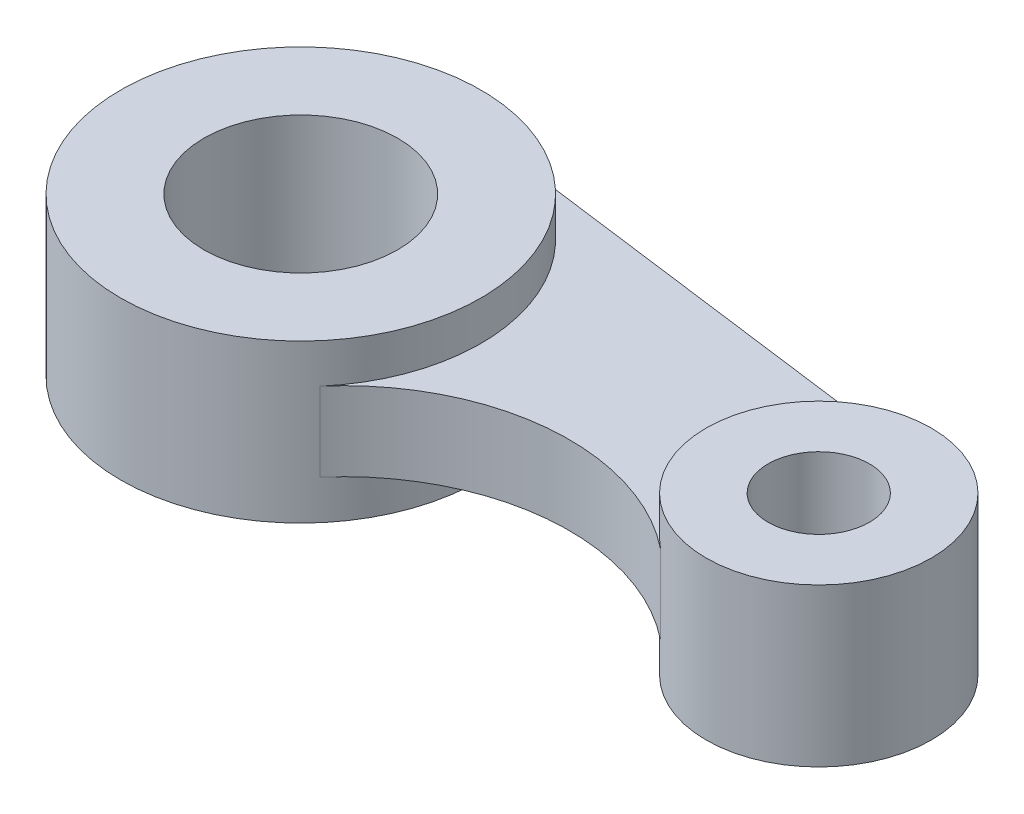
ISO-10303-21;
HEADER;
FILE_DESCRIPTION(('STEP AP214'),'2;1');
FILE_NAME('part.step','',(''),(''),'','','');
FILE_SCHEMA(('AUTOMOTIVE_DESIGN { 1 0 10303 214 1 1 1 1 }'));
ENDSEC;
DATA;
#1=APPLICATION_CONTEXT('core data for automotive mechanical design processes');
#2=APPLICATION_PROTOCOL_DEFINITION('international standard','automotive_design',2000,#1);
#3=PRODUCT_CONTEXT('',#1,'mechanical');
#4=PRODUCT('Part','Part','',(#3));
#5=PRODUCT_RELATED_PRODUCT_CATEGORY('part','',(#4));
#6=PRODUCT_DEFINITION_FORMATION('','',#4);
#7=PRODUCT_DEFINITION_CONTEXT('part definition',#1,'design');
#8=PRODUCT_DEFINITION('design','',#6,#7);
#9=PRODUCT_DEFINITION_SHAPE('','',#8);
#10=(LENGTH_UNIT() NAMED_UNIT(*) SI_UNIT(.MILLI.,.METRE.));
#11=(NAMED_UNIT(*) PLANE_ANGLE_UNIT() SI_UNIT($,.RADIAN.));
#12=(NAMED_UNIT(*) SI_UNIT($,.STERADIAN.) SOLID_ANGLE_UNIT());
#13=UNCERTAINTY_MEASURE_WITH_UNIT(LENGTH_MEASURE(1.E-05),#10,'distance_accuracy_value','');
#14=(GEOMETRIC_REPRESENTATION_CONTEXT(3) GLOBAL_UNCERTAINTY_ASSIGNED_CONTEXT((#13)) GLOBAL_UNIT_ASSIGNED_CONTEXT((#10,
#11,#12)) REPRESENTATION_CONTEXT('',''));
#15=CARTESIAN_POINT('',(0.,0.,0.));
#16=DIRECTION('',(0.,0.,1.));
#17=DIRECTION('',(1.,0.,0.));
#18=AXIS2_PLACEMENT_3D('',#15,#16,#17);
#19=CARTESIAN_POINT('',(-122.899042893048,70.,0.));
#20=DIRECTION('',(0.,-1.,0.));
#21=DIRECTION('',(0.,0.,-1.));
#22=AXIS2_PLACEMENT_3D('',#19,#20,#21);
#23=CYLINDRICAL_SURFACE('',#22,80.);
#24=CARTESIAN_POINT('',(-122.899042893048,0.,0.));
#25=DIRECTION('',(0.,1.,0.));
#26=DIRECTION('',(0.,0.,1.));
#27=AXIS2_PLACEMENT_3D('',#24,#25,#26);
#28=CIRCLE('',#27,80.);
#29=CARTESIAN_POINT('',(-122.899042893048,0.,80.));
#30=VERTEX_POINT('',#29);
#31=EDGE_CURVE('E43',#30,#30,#28,.T.);
#32=ORIENTED_EDGE('',*,*,#31,.T.);
#33=EDGE_LOOP('',(#32));
#34=FACE_BOUND('',#33,.T.);
#35=CARTESIAN_POINT('',(-122.899042893048,70.,0.));
#36=DIRECTION('',(0.,1.,0.));
#37=DIRECTION('',(0.,0.,1.));
#38=AXIS2_PLACEMENT_3D('',#35,#36,#37);
#39=CIRCLE('',#38,80.);
#40=CARTESIAN_POINT('',(-122.899042893048,70.,80.));
#41=VERTEX_POINT('',#40);
#42=EDGE_CURVE('E11',#41,#41,#39,.T.);
#43=ORIENTED_EDGE('',*,*,#42,.F.);
#44=EDGE_LOOP('',(#43));
#45=FACE_BOUND('',#44,.T.);
#46=CARTESIAN_POINT('',(-122.899042893048,17.5,0.));
#47=DIRECTION('',(0.,1.,0.));
#48=DIRECTION('',(0.,0.,1.));
#49=AXIS2_PLACEMENT_3D('',#46,#47,#48);
#50=CIRCLE('',#49,80.);
#51=CARTESIAN_POINT('',(-62.2227143906329,17.5,52.138116186404));
#52=VERTEX_POINT('',#51);
#53=CARTESIAN_POINT('',(-112.464260284353,17.5,-79.3165513112444));
#54=VERTEX_POINT('',#53);
#55=EDGE_CURVE('E168',#52,#54,#50,.T.);
#56=ORIENTED_EDGE('',*,*,#55,.F.);
#57=DIRECTION('',(0.,1.,0.));
#58=VECTOR('',#57,1.);
#59=CARTESIAN_POINT('',(-62.2227143906329,17.5,52.138116186404));
#60=LINE('',#59,#58);
#61=CARTESIAN_POINT('',(-62.2227143906329,52.5,52.138116186404));
#62=VERTEX_POINT('',#61);
#63=EDGE_CURVE('E96',#52,#62,#60,.T.);
#64=ORIENTED_EDGE('',*,*,#63,.T.);
#65=CARTESIAN_POINT('',(-122.899042893048,52.5,0.));
#66=DIRECTION('',(0.,1.,0.));
#67=DIRECTION('',(0.,0.,1.));
#68=AXIS2_PLACEMENT_3D('',#65,#66,#67);
#69=CIRCLE('',#68,80.);
#70=CARTESIAN_POINT('',(-112.464260284353,52.5,-79.3165513112444));
#71=VERTEX_POINT('',#70);
#72=EDGE_CURVE('E102',#62,#71,#69,.T.);
#73=ORIENTED_EDGE('',*,*,#72,.T.);
#74=DIRECTION('',(0.,1.,0.));
#75=VECTOR('',#74,1.);
#76=CARTESIAN_POINT('',(-112.464260284353,17.5,-79.3165513112444));
#77=LINE('',#76,#75);
#78=EDGE_CURVE('E125',#54,#71,#77,.T.);
#79=ORIENTED_EDGE('',*,*,#78,.F.);
#80=EDGE_LOOP('',(#56,#64,#73,#79));
#81=FACE_BOUND('',#80,.T.);
#82=ADVANCED_FACE('F39',(#34,#45,#81),#23,.T.);
#83=CARTESIAN_POINT('',(-122.899042893048,70.,0.));
#84=DIRECTION('',(0.,-1.,0.));
#85=DIRECTION('',(0.,0.,-1.));
#86=AXIS2_PLACEMENT_3D('',#83,#84,#85);
#87=CYLINDRICAL_SURFACE('',#86,43.);
#88=CARTESIAN_POINT('',(-122.899042893048,70.,0.));
#89=DIRECTION('',(0.,1.,0.));
#90=DIRECTION('',(0.,0.,1.));
#91=AXIS2_PLACEMENT_3D('',#88,#89,#90);
#92=CIRCLE('',#91,43.);
#93=CARTESIAN_POINT('',(-122.899042893048,70.,43.));
#94=VERTEX_POINT('',#93);
#95=EDGE_CURVE('E49',#94,#94,#92,.T.);
#96=ORIENTED_EDGE('',*,*,#95,.T.);
#97=EDGE_LOOP('',(#96));
#98=FACE_BOUND('',#97,.T.);
#99=CARTESIAN_POINT('',(-122.899042893048,0.,0.));
#100=DIRECTION('',(0.,1.,0.));
#101=DIRECTION('',(0.,0.,1.));
#102=AXIS2_PLACEMENT_3D('',#99,#100,#101);
#103=CIRCLE('',#102,43.);
#104=CARTESIAN_POINT('',(-122.899042893048,0.,43.));
#105=VERTEX_POINT('',#104);
#106=EDGE_CURVE('E95',#105,#105,#103,.T.);
#107=ORIENTED_EDGE('',*,*,#106,.F.);
#108=EDGE_LOOP('',(#107));
#109=FACE_BOUND('',#108,.T.);
#110=ADVANCED_FACE('F41',(#98,#109),#87,.F.);
#111=CARTESIAN_POINT('',(0.,70.,0.));
#112=DIRECTION('',(0.,1.,0.));
#113=DIRECTION('',(0.,0.,1.));
#114=AXIS2_PLACEMENT_3D('',#111,#112,#113);
#115=PLANE('',#114);
#116=ORIENTED_EDGE('',*,*,#95,.F.);
#117=EDGE_LOOP('',(#116));
#118=FACE_BOUND('',#117,.T.);
#119=ORIENTED_EDGE('',*,*,#42,.T.);
#120=EDGE_LOOP('',(#119));
#121=FACE_BOUND('',#120,.T.);
#122=ADVANCED_FACE('F144',(#118,#121),#115,.T.);
#123=CARTESIAN_POINT('',(0.,0.,0.));
#124=DIRECTION('',(0.,1.,0.));
#125=DIRECTION('',(0.,0.,1.));
#126=AXIS2_PLACEMENT_3D('',#123,#124,#125);
#127=PLANE('',#126);
#128=ORIENTED_EDGE('',*,*,#106,.T.);
#129=EDGE_LOOP('',(#128));
#130=FACE_BOUND('',#129,.T.);
#131=ORIENTED_EDGE('',*,*,#31,.F.);
#132=EDGE_LOOP('',(#131));
#133=FACE_BOUND('',#132,.T.);
#134=ADVANCED_FACE('F142',(#130,#133),#127,.F.);
#135=CARTESIAN_POINT('',(13.6226962373863,17.5,117.310761419409));
#136=DIRECTION('',(0.,1.,0.));
#137=DIRECTION('',(0.,0.,1.));
#138=AXIS2_PLACEMENT_3D('',#135,#136,#137);
#139=CYLINDRICAL_SURFACE('',#138,100.);
#140=CARTESIAN_POINT('',(13.6226962373863,52.5,117.310761419409));
#141=DIRECTION('',(0.,1.,0.));
#142=DIRECTION('',(0.,0.,1.));
#143=AXIS2_PLACEMENT_3D('',#140,#141,#142);
#144=CIRCLE('',#143,100.);
#145=CARTESIAN_POINT('',(75.9415368170965,52.5,39.103587139803));
#146=VERTEX_POINT('',#145);
#147=EDGE_CURVE('E90',#146,#62,#144,.T.);
#148=ORIENTED_EDGE('',*,*,#147,.T.);
#149=ORIENTED_EDGE('',*,*,#63,.F.);
#150=CARTESIAN_POINT('',(13.6226962373863,17.5,117.310761419409));
#151=DIRECTION('',(0.,1.,0.));
#152=DIRECTION('',(0.,0.,1.));
#153=AXIS2_PLACEMENT_3D('',#150,#151,#152);
#154=CIRCLE('',#153,100.);
#155=CARTESIAN_POINT('',(75.9415368170965,17.5,39.1035871398031));
#156=VERTEX_POINT('',#155);
#157=EDGE_CURVE('E84',#156,#52,#154,.T.);
#158=ORIENTED_EDGE('',*,*,#157,.F.);
#159=DIRECTION('',(0.,1.,0.));
#160=VECTOR('',#159,1.);
#161=CARTESIAN_POINT('',(75.9415368170965,17.5,39.1035871398031));
#162=LINE('',#161,#160);
#163=EDGE_CURVE('E87',#156,#146,#162,.T.);
#164=ORIENTED_EDGE('',*,*,#163,.T.);
#165=EDGE_LOOP('',(#148,#149,#158,#164));
#166=FACE_BOUND('',#165,.T.);
#167=ADVANCED_FACE('F89',(#166),#139,.F.);
#168=CARTESIAN_POINT('',(-112.464260284353,17.5,-79.3165513112444));
#169=DIRECTION('',(-0.130434782608696,0.,0.991456891390555));
#170=DIRECTION('',(0.991456891390555,0.,0.130434782608696));
#171=AXIS2_PLACEMENT_3D('',#168,#169,#170);
#172=PLANE('',#171);
#173=DIRECTION('',(0.991456891390555,0.,0.130434782608696));
#174=VECTOR('',#173,1.);
#175=CARTESIAN_POINT('',(-112.464260284353,52.5,-79.3165513112444));
#176=LINE('',#175,#174);
#177=CARTESIAN_POINT('',(113.622696237386,52.5,-49.5728445695277));
#178=VERTEX_POINT('',#177);
#179=EDGE_CURVE('E57',#71,#178,#176,.T.);
#180=ORIENTED_EDGE('',*,*,#179,.T.);
#181=DIRECTION('',(0.,1.,0.));
#182=VECTOR('',#181,1.);
#183=CARTESIAN_POINT('',(113.622696237386,17.5,-49.5728445695277));
#184=LINE('',#183,#182);
#185=CARTESIAN_POINT('',(113.622696237386,17.5,-49.5728445695277));
#186=VERTEX_POINT('',#185);
#187=EDGE_CURVE('E107',#186,#178,#184,.T.);
#188=ORIENTED_EDGE('',*,*,#187,.F.);
#189=DIRECTION('',(0.991456891390555,0.,0.130434782608696));
#190=VECTOR('',#189,1.);
#191=CARTESIAN_POINT('',(-112.464260284353,17.5,-79.3165513112444));
#192=LINE('',#191,#190);
#193=EDGE_CURVE('E66',#54,#186,#192,.T.);
#194=ORIENTED_EDGE('',*,*,#193,.F.);
#195=ORIENTED_EDGE('',*,*,#78,.T.);
#196=EDGE_LOOP('',(#180,#188,#194,#195));
#197=FACE_BOUND('',#196,.T.);
#198=ADVANCED_FACE('F150',(#197),#172,.F.);
#199=CARTESIAN_POINT('',(107.100957106952,17.5,0.));
#200=DIRECTION('',(0.,1.,0.));
#201=DIRECTION('',(0.,0.,1.));
#202=AXIS2_PLACEMENT_3D('',#199,#200,#201);
#203=PLANE('',#202);
#204=CARTESIAN_POINT('',(107.100957106952,17.5,0.));
#205=DIRECTION('',(0.,1.,0.));
#206=DIRECTION('',(0.,0.,1.));
#207=AXIS2_PLACEMENT_3D('',#204,#205,#206);
#208=CIRCLE('',#207,50.);
#209=EDGE_CURVE('E122',#186,#156,#208,.T.);
#210=ORIENTED_EDGE('',*,*,#209,.T.);
#211=ORIENTED_EDGE('',*,*,#157,.T.);
#212=ORIENTED_EDGE('',*,*,#55,.T.);
#213=ORIENTED_EDGE('',*,*,#193,.T.);
#214=EDGE_LOOP('',(#210,#211,#212,#213));
#215=FACE_BOUND('',#214,.T.);
#216=ADVANCED_FACE('F211',(#215),#203,.F.);
#217=CARTESIAN_POINT('',(107.100957106952,52.5,0.));
#218=DIRECTION('',(0.,1.,0.));
#219=DIRECTION('',(0.,0.,1.));
#220=AXIS2_PLACEMENT_3D('',#217,#218,#219);
#221=PLANE('',#220);
#222=CARTESIAN_POINT('',(107.100957106952,52.5,0.));
#223=DIRECTION('',(0.,1.,0.));
#224=DIRECTION('',(0.,0.,1.));
#225=AXIS2_PLACEMENT_3D('',#222,#223,#224);
#226=CIRCLE('',#225,50.);
#227=EDGE_CURVE('E99',#178,#146,#226,.T.);
#228=ORIENTED_EDGE('',*,*,#227,.F.);
#229=ORIENTED_EDGE('',*,*,#179,.F.);
#230=ORIENTED_EDGE('',*,*,#72,.F.);
#231=ORIENTED_EDGE('',*,*,#147,.F.);
#232=EDGE_LOOP('',(#228,#229,#230,#231));
#233=FACE_BOUND('',#232,.T.);
#234=ADVANCED_FACE('F98',(#233),#221,.T.);
#235=CARTESIAN_POINT('',(107.100957106952,70.,0.));
#236=DIRECTION('',(0.,-1.,0.));
#237=DIRECTION('',(0.,0.,-1.));
#238=AXIS2_PLACEMENT_3D('',#235,#236,#237);
#239=CYLINDRICAL_SURFACE('',#238,50.);
#240=CARTESIAN_POINT('',(107.100957106952,70.,0.));
#241=DIRECTION('',(0.,1.,0.));
#242=DIRECTION('',(0.,0.,1.));
#243=AXIS2_PLACEMENT_3D('',#240,#241,#242);
#244=CIRCLE('',#243,50.);
#245=CARTESIAN_POINT('',(107.100957106952,70.,50.));
#246=VERTEX_POINT('',#245);
#247=EDGE_CURVE('E109',#246,#246,#244,.T.);
#248=ORIENTED_EDGE('',*,*,#247,.F.);
#249=EDGE_LOOP('',(#248));
#250=FACE_BOUND('',#249,.T.);
#251=CARTESIAN_POINT('',(107.100957106952,0.,0.));
#252=DIRECTION('',(0.,1.,0.));
#253=DIRECTION('',(0.,0.,1.));
#254=AXIS2_PLACEMENT_3D('',#251,#252,#253);
#255=CIRCLE('',#254,50.);
#256=CARTESIAN_POINT('',(107.100957106952,0.,50.));
#257=VERTEX_POINT('',#256);
#258=EDGE_CURVE('E176',#257,#257,#255,.T.);
#259=ORIENTED_EDGE('',*,*,#258,.T.);
#260=EDGE_LOOP('',(#259));
#261=FACE_BOUND('',#260,.T.);
#262=ORIENTED_EDGE('',*,*,#163,.F.);
#263=ORIENTED_EDGE('',*,*,#209,.F.);
#264=ORIENTED_EDGE('',*,*,#187,.T.);
#265=ORIENTED_EDGE('',*,*,#227,.T.);
#266=EDGE_LOOP('',(#262,#263,#264,#265));
#267=FACE_BOUND('',#266,.T.);
#268=ADVANCED_FACE('F106',(#250,#261,#267),#239,.T.);
#269=CARTESIAN_POINT('',(107.100957106952,70.,0.));
#270=DIRECTION('',(0.,-1.,0.));
#271=DIRECTION('',(0.,0.,-1.));
#272=AXIS2_PLACEMENT_3D('',#269,#270,#271);
#273=CYLINDRICAL_SURFACE('',#272,22.5);
#274=CARTESIAN_POINT('',(107.100957106952,70.,0.));
#275=DIRECTION('',(0.,1.,0.));
#276=DIRECTION('',(0.,0.,1.));
#277=AXIS2_PLACEMENT_3D('',#274,#275,#276);
#278=CIRCLE('',#277,22.5);
#279=CARTESIAN_POINT('',(107.100957106952,70.,22.5));
#280=VERTEX_POINT('',#279);
#281=EDGE_CURVE('E113',#280,#280,#278,.T.);
#282=ORIENTED_EDGE('',*,*,#281,.T.);
#283=EDGE_LOOP('',(#282));
#284=FACE_BOUND('',#283,.T.);
#285=CARTESIAN_POINT('',(107.100957106952,0.,0.));
#286=DIRECTION('',(0.,1.,0.));
#287=DIRECTION('',(0.,0.,1.));
#288=AXIS2_PLACEMENT_3D('',#285,#286,#287);
#289=CIRCLE('',#288,22.5);
#290=CARTESIAN_POINT('',(107.100957106952,0.,22.5));
#291=VERTEX_POINT('',#290);
#292=EDGE_CURVE('E180',#291,#291,#289,.T.);
#293=ORIENTED_EDGE('',*,*,#292,.F.);
#294=EDGE_LOOP('',(#293));
#295=FACE_BOUND('',#294,.T.);
#296=ADVANCED_FACE('F188',(#284,#295),#273,.F.);
#297=CARTESIAN_POINT('',(0.,70.,0.));
#298=DIRECTION('',(0.,1.,0.));
#299=DIRECTION('',(0.,0.,1.));
#300=AXIS2_PLACEMENT_3D('',#297,#298,#299);
#301=PLANE('',#300);
#302=ORIENTED_EDGE('',*,*,#281,.F.);
#303=EDGE_LOOP('',(#302));
#304=FACE_BOUND('',#303,.T.);
#305=ORIENTED_EDGE('',*,*,#247,.T.);
#306=EDGE_LOOP('',(#305));
#307=FACE_BOUND('',#306,.T.);
#308=ADVANCED_FACE('F191',(#304,#307),#301,.T.);
#309=CARTESIAN_POINT('',(0.,0.,0.));
#310=DIRECTION('',(0.,1.,0.));
#311=DIRECTION('',(0.,0.,1.));
#312=AXIS2_PLACEMENT_3D('',#309,#310,#311);
#313=PLANE('',#312);
#314=ORIENTED_EDGE('',*,*,#292,.T.);
#315=EDGE_LOOP('',(#314));
#316=FACE_BOUND('',#315,.T.);
#317=ORIENTED_EDGE('',*,*,#258,.F.);
#318=EDGE_LOOP('',(#317));
#319=FACE_BOUND('',#318,.T.);
#320=ADVANCED_FACE('F194',(#316,#319),#313,.F.);
#321=CLOSED_SHELL('',(#82,#110,#122,#134,#167,#198,#216,#234,#268,#296,#308,#320));
#322=MANIFOLD_SOLID_BREP('B2',#321);
#323=ADVANCED_BREP_SHAPE_REPRESENTATION('',(#18,#322),#14);
#324=SHAPE_DEFINITION_REPRESENTATION(#9,#323);
ENDSEC;
END-ISO-10303-21;
